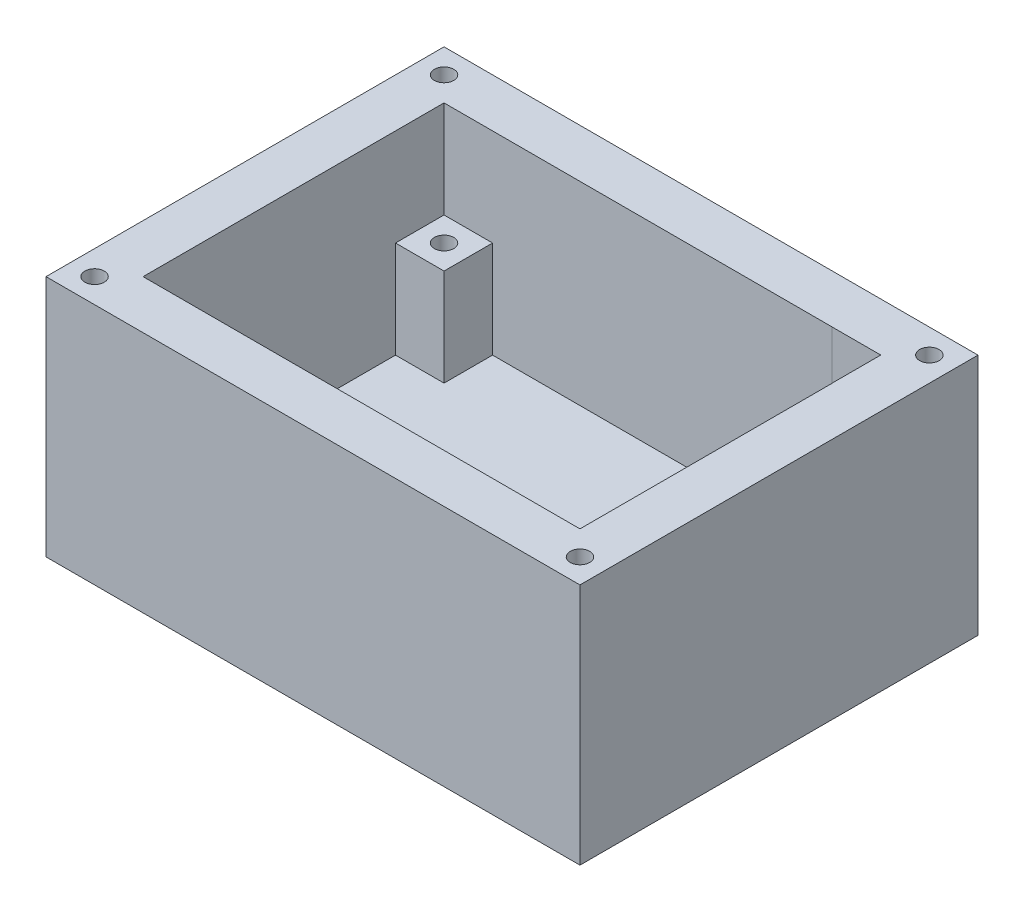
ISO-10303-21;
HEADER;
FILE_DESCRIPTION(('STEP AP214'),'2;1');
FILE_NAME('part.step','',(''),(''),'','','');
FILE_SCHEMA(('AUTOMOTIVE_DESIGN { 1 0 10303 214 1 1 1 1 }'));
ENDSEC;
DATA;
#1=APPLICATION_CONTEXT('core data for automotive mechanical design processes');
#2=APPLICATION_PROTOCOL_DEFINITION('international standard','automotive_design',2000,#1);
#3=PRODUCT_CONTEXT('',#1,'mechanical');
#4=PRODUCT('Part','Part','',(#3));
#5=PRODUCT_RELATED_PRODUCT_CATEGORY('part','',(#4));
#6=PRODUCT_DEFINITION_FORMATION('','',#4);
#7=PRODUCT_DEFINITION_CONTEXT('part definition',#1,'design');
#8=PRODUCT_DEFINITION('design','',#6,#7);
#9=PRODUCT_DEFINITION_SHAPE('','',#8);
#10=(LENGTH_UNIT() NAMED_UNIT(*) SI_UNIT(.MILLI.,.METRE.));
#11=(NAMED_UNIT(*) PLANE_ANGLE_UNIT() SI_UNIT($,.RADIAN.));
#12=(NAMED_UNIT(*) SI_UNIT($,.STERADIAN.) SOLID_ANGLE_UNIT());
#13=UNCERTAINTY_MEASURE_WITH_UNIT(LENGTH_MEASURE(1.E-05),#10,'distance_accuracy_value','');
#14=(GEOMETRIC_REPRESENTATION_CONTEXT(3) GLOBAL_UNCERTAINTY_ASSIGNED_CONTEXT((#13)) GLOBAL_UNIT_ASSIGNED_CONTEXT((#10,
#11,#12)) REPRESENTATION_CONTEXT('',''));
#15=CARTESIAN_POINT('',(0.,0.,0.));
#16=DIRECTION('',(0.,0.,1.));
#17=DIRECTION('',(1.,0.,0.));
#18=AXIS2_PLACEMENT_3D('',#15,#16,#17);
#19=CARTESIAN_POINT('',(0.,20.,-9.99999999999999));
#20=DIRECTION('',(0.,0.,1.));
#21=DIRECTION('',(1.,0.,0.));
#22=AXIS2_PLACEMENT_3D('',#19,#20,#21);
#23=PLANE('',#22);
#24=DIRECTION('',(-1.,0.,0.));
#25=VECTOR('',#24,1.);
#26=CARTESIAN_POINT('',(-10.,10.,-9.99999999999999));
#27=LINE('',#26,#25);
#28=CARTESIAN_POINT('',(-5.,10.,-9.99999999999999));
#29=VERTEX_POINT('',#28);
#30=CARTESIAN_POINT('',(-10.,10.,-9.99999999999999));
#31=VERTEX_POINT('',#30);
#32=EDGE_CURVE('E427',#29,#31,#27,.T.);
#33=ORIENTED_EDGE('',*,*,#32,.F.);
#34=DIRECTION('',(0.,-1.,0.));
#35=VECTOR('',#34,1.);
#36=CARTESIAN_POINT('',(-5.,20.,-9.99999999999999));
#37=LINE('',#36,#35);
#38=CARTESIAN_POINT('',(-5.,0.,-9.99999999999999));
#39=VERTEX_POINT('',#38);
#40=EDGE_CURVE('E190',#29,#39,#37,.T.);
#41=ORIENTED_EDGE('',*,*,#40,.T.);
#42=DIRECTION('',(-1.,0.,0.));
#43=VECTOR('',#42,1.);
#44=CARTESIAN_POINT('',(0.,0.,-9.99999999999999));
#45=LINE('',#44,#43);
#46=CARTESIAN_POINT('',(-10.,0.,-9.99999999999999));
#47=VERTEX_POINT('',#46);
#48=EDGE_CURVE('E144',#39,#47,#45,.T.);
#49=ORIENTED_EDGE('',*,*,#48,.T.);
#50=DIRECTION('',(0.,-1.,0.));
#51=VECTOR('',#50,1.);
#52=CARTESIAN_POINT('',(-10.,20.,-9.99999999999999));
#53=LINE('',#52,#51);
#54=EDGE_CURVE('E187',#31,#47,#53,.T.);
#55=ORIENTED_EDGE('',*,*,#54,.F.);
#56=EDGE_LOOP('',(#33,#41,#49,#55));
#57=FACE_BOUND('',#56,.T.);
#58=ADVANCED_FACE('F34',(#57),#23,.F.);
#59=CARTESIAN_POINT('',(-10.,20.,0.));
#60=DIRECTION('',(-1.,0.,0.));
#61=DIRECTION('',(0.,0.,1.));
#62=AXIS2_PLACEMENT_3D('',#59,#60,#61);
#63=PLANE('',#62);
#64=DIRECTION('',(0.,-1.,0.));
#65=VECTOR('',#64,1.);
#66=CARTESIAN_POINT('',(-10.,20.,-5.));
#67=LINE('',#66,#65);
#68=CARTESIAN_POINT('',(-10.,10.,-5.));
#69=VERTEX_POINT('',#68);
#70=CARTESIAN_POINT('',(-10.,0.,-5.));
#71=VERTEX_POINT('',#70);
#72=EDGE_CURVE('E184',#69,#71,#67,.T.);
#73=ORIENTED_EDGE('',*,*,#72,.F.);
#74=DIRECTION('',(0.,0.,1.));
#75=VECTOR('',#74,1.);
#76=CARTESIAN_POINT('',(-10.,10.,-9.99999999999999));
#77=LINE('',#76,#75);
#78=EDGE_CURVE('E439',#31,#69,#77,.T.);
#79=ORIENTED_EDGE('',*,*,#78,.F.);
#80=ORIENTED_EDGE('',*,*,#54,.T.);
#81=DIRECTION('',(0.,0.,-1.));
#82=VECTOR('',#81,1.);
#83=CARTESIAN_POINT('',(-10.,0.,0.));
#84=LINE('',#83,#82);
#85=EDGE_CURVE('E147',#71,#47,#84,.T.);
#86=ORIENTED_EDGE('',*,*,#85,.F.);
#87=EDGE_LOOP('',(#73,#79,#80,#86));
#88=FACE_BOUND('',#87,.T.);
#89=ADVANCED_FACE('F344',(#88),#63,.T.);
#90=CARTESIAN_POINT('',(-45.,20.,0.));
#91=DIRECTION('',(1.,0.,0.));
#92=DIRECTION('',(0.,0.,-1.));
#93=AXIS2_PLACEMENT_3D('',#90,#91,#92);
#94=PLANE('',#93);
#95=DIRECTION('',(0.,-1.,0.));
#96=VECTOR('',#95,1.);
#97=CARTESIAN_POINT('',(-45.,20.,-36.));
#98=LINE('',#97,#96);
#99=CARTESIAN_POINT('',(-45.,10.,-36.));
#100=VERTEX_POINT('',#99);
#101=CARTESIAN_POINT('',(-45.,0.,-36.));
#102=VERTEX_POINT('',#101);
#103=EDGE_CURVE('E38',#100,#102,#98,.T.);
#104=ORIENTED_EDGE('',*,*,#103,.F.);
#105=DIRECTION('',(0.,0.,-1.));
#106=VECTOR('',#105,1.);
#107=CARTESIAN_POINT('',(-45.,10.,-31.));
#108=LINE('',#107,#106);
#109=CARTESIAN_POINT('',(-45.,10.,-31.));
#110=VERTEX_POINT('',#109);
#111=EDGE_CURVE('E438',#110,#100,#108,.T.);
#112=ORIENTED_EDGE('',*,*,#111,.F.);
#113=DIRECTION('',(0.,-1.,0.));
#114=VECTOR('',#113,1.);
#115=CARTESIAN_POINT('',(-45.,20.,-31.));
#116=LINE('',#115,#114);
#117=CARTESIAN_POINT('',(-45.,0.,-31.));
#118=VERTEX_POINT('',#117);
#119=EDGE_CURVE('E129',#110,#118,#116,.T.);
#120=ORIENTED_EDGE('',*,*,#119,.T.);
#121=DIRECTION('',(0.,0.,1.));
#122=VECTOR('',#121,1.);
#123=CARTESIAN_POINT('',(-45.,0.,0.));
#124=LINE('',#123,#122);
#125=EDGE_CURVE('E133',#102,#118,#124,.T.);
#126=ORIENTED_EDGE('',*,*,#125,.F.);
#127=EDGE_LOOP('',(#104,#112,#120,#126));
#128=FACE_BOUND('',#127,.T.);
#129=ADVANCED_FACE('F36',(#128),#94,.T.);
#130=CARTESIAN_POINT('',(0.,20.,-31.));
#131=DIRECTION('',(0.,0.,-1.));
#132=DIRECTION('',(-1.,0.,0.));
#133=AXIS2_PLACEMENT_3D('',#130,#131,#132);
#134=PLANE('',#133);
#135=DIRECTION('',(1.,0.,0.));
#136=VECTOR('',#135,1.);
#137=CARTESIAN_POINT('',(-45.,10.,-31.));
#138=LINE('',#137,#136);
#139=CARTESIAN_POINT('',(-50.,10.,-31.));
#140=VERTEX_POINT('',#139);
#141=EDGE_CURVE('E321',#140,#110,#138,.T.);
#142=ORIENTED_EDGE('',*,*,#141,.F.);
#143=DIRECTION('',(0.,-1.,0.));
#144=VECTOR('',#143,1.);
#145=CARTESIAN_POINT('',(-50.,20.,-31.));
#146=LINE('',#145,#144);
#147=CARTESIAN_POINT('',(-50.,0.,-31.));
#148=VERTEX_POINT('',#147);
#149=EDGE_CURVE('E172',#140,#148,#146,.T.);
#150=ORIENTED_EDGE('',*,*,#149,.T.);
#151=DIRECTION('',(1.,0.,0.));
#152=VECTOR('',#151,1.);
#153=CARTESIAN_POINT('',(0.,0.,-31.));
#154=LINE('',#153,#152);
#155=EDGE_CURVE('E162',#148,#118,#154,.T.);
#156=ORIENTED_EDGE('',*,*,#155,.T.);
#157=ORIENTED_EDGE('',*,*,#119,.F.);
#158=EDGE_LOOP('',(#142,#150,#156,#157));
#159=FACE_BOUND('',#158,.T.);
#160=ADVANCED_FACE('F377',(#159),#134,.F.);
#161=CARTESIAN_POINT('',(0.,20.,-41.));
#162=DIRECTION('',(0.,0.,1.));
#163=DIRECTION('',(1.,0.,0.));
#164=AXIS2_PLACEMENT_3D('',#161,#162,#163);
#165=PLANE('',#164);
#166=DIRECTION('',(0.,-1.,0.));
#167=VECTOR('',#166,1.);
#168=CARTESIAN_POINT('',(0.,20.,-41.));
#169=LINE('',#168,#167);
#170=CARTESIAN_POINT('',(0.,20.,-41.));
#171=VERTEX_POINT('',#170);
#172=CARTESIAN_POINT('',(0.,-5.,-41.));
#173=VERTEX_POINT('',#172);
#174=EDGE_CURVE('E166',#171,#173,#169,.T.);
#175=ORIENTED_EDGE('',*,*,#174,.T.);
#176=DIRECTION('',(1.,0.,0.));
#177=VECTOR('',#176,1.);
#178=CARTESIAN_POINT('',(-55.,-5.,-41.));
#179=LINE('',#178,#177);
#180=CARTESIAN_POINT('',(-55.,-5.,-41.));
#181=VERTEX_POINT('',#180);
#182=EDGE_CURVE('E555',#181,#173,#179,.T.);
#183=ORIENTED_EDGE('',*,*,#182,.F.);
#184=DIRECTION('',(0.,-1.,0.));
#185=VECTOR('',#184,1.);
#186=CARTESIAN_POINT('',(-55.,20.,-41.));
#187=LINE('',#186,#185);
#188=CARTESIAN_POINT('',(-55.,20.,-41.));
#189=VERTEX_POINT('',#188);
#190=EDGE_CURVE('E11',#189,#181,#187,.T.);
#191=ORIENTED_EDGE('',*,*,#190,.F.);
#192=DIRECTION('',(-1.,0.,0.));
#193=VECTOR('',#192,1.);
#194=CARTESIAN_POINT('',(0.,20.,-41.));
#195=LINE('',#194,#193);
#196=EDGE_CURVE('E123',#171,#189,#195,.T.);
#197=ORIENTED_EDGE('',*,*,#196,.F.);
#198=EDGE_LOOP('',(#175,#183,#191,#197));
#199=FACE_BOUND('',#198,.T.);
#200=ADVANCED_FACE('F371',(#199),#165,.F.);
#201=CARTESIAN_POINT('',(-55.,20.,0.));
#202=DIRECTION('',(-1.,0.,0.));
#203=DIRECTION('',(0.,0.,1.));
#204=AXIS2_PLACEMENT_3D('',#201,#202,#203);
#205=PLANE('',#204);
#206=ORIENTED_EDGE('',*,*,#190,.T.);
#207=DIRECTION('',(0.,0.,-1.));
#208=VECTOR('',#207,1.);
#209=CARTESIAN_POINT('',(-55.,-5.,0.));
#210=LINE('',#209,#208);
#211=CARTESIAN_POINT('',(-55.,-5.,0.));
#212=VERTEX_POINT('',#211);
#213=EDGE_CURVE('E113',#212,#181,#210,.T.);
#214=ORIENTED_EDGE('',*,*,#213,.F.);
#215=DIRECTION('',(0.,-1.,0.));
#216=VECTOR('',#215,1.);
#217=CARTESIAN_POINT('',(-55.,20.,0.));
#218=LINE('',#217,#216);
#219=CARTESIAN_POINT('',(-55.,20.,0.));
#220=VERTEX_POINT('',#219);
#221=EDGE_CURVE('E43',#220,#212,#218,.T.);
#222=ORIENTED_EDGE('',*,*,#221,.F.);
#223=DIRECTION('',(0.,0.,-1.));
#224=VECTOR('',#223,1.);
#225=CARTESIAN_POINT('',(-55.,20.,0.));
#226=LINE('',#225,#224);
#227=EDGE_CURVE('E110',#220,#189,#226,.T.);
#228=ORIENTED_EDGE('',*,*,#227,.T.);
#229=EDGE_LOOP('',(#206,#214,#222,#228));
#230=FACE_BOUND('',#229,.T.);
#231=ADVANCED_FACE('F109',(#230),#205,.T.);
#232=CARTESIAN_POINT('',(0.,20.,0.));
#233=DIRECTION('',(0.,0.,1.));
#234=DIRECTION('',(1.,0.,0.));
#235=AXIS2_PLACEMENT_3D('',#232,#233,#234);
#236=PLANE('',#235);
#237=ORIENTED_EDGE('',*,*,#221,.T.);
#238=DIRECTION('',(-1.,0.,0.));
#239=VECTOR('',#238,1.);
#240=CARTESIAN_POINT('',(-55.,-5.,0.));
#241=LINE('',#240,#239);
#242=CARTESIAN_POINT('',(0.,-5.,0.));
#243=VERTEX_POINT('',#242);
#244=EDGE_CURVE('E561',#243,#212,#241,.T.);
#245=ORIENTED_EDGE('',*,*,#244,.F.);
#246=DIRECTION('',(0.,-1.,0.));
#247=VECTOR('',#246,1.);
#248=CARTESIAN_POINT('',(0.,20.,0.));
#249=LINE('',#248,#247);
#250=CARTESIAN_POINT('',(0.,20.,0.));
#251=VERTEX_POINT('',#250);
#252=EDGE_CURVE('E118',#251,#243,#249,.T.);
#253=ORIENTED_EDGE('',*,*,#252,.F.);
#254=DIRECTION('',(-1.,0.,0.));
#255=VECTOR('',#254,1.);
#256=CARTESIAN_POINT('',(0.,20.,0.));
#257=LINE('',#256,#255);
#258=EDGE_CURVE('E121',#251,#220,#257,.T.);
#259=ORIENTED_EDGE('',*,*,#258,.T.);
#260=EDGE_LOOP('',(#237,#245,#253,#259));
#261=FACE_BOUND('',#260,.T.);
#262=ADVANCED_FACE('F126',(#261),#236,.T.);
#263=CARTESIAN_POINT('',(0.,20.,-36.));
#264=DIRECTION('',(0.,0.,-1.));
#265=DIRECTION('',(-1.,0.,0.));
#266=AXIS2_PLACEMENT_3D('',#263,#264,#265);
#267=PLANE('',#266);
#268=DIRECTION('',(1.,0.,0.));
#269=VECTOR('',#268,1.);
#270=CARTESIAN_POINT('',(0.,0.,-36.));
#271=LINE('',#270,#269);
#272=CARTESIAN_POINT('',(-10.0136520481523,0.,-36.));
#273=VERTEX_POINT('',#272);
#274=EDGE_CURVE('E136',#102,#273,#271,.T.);
#275=ORIENTED_EDGE('',*,*,#274,.T.);
#276=DIRECTION('',(0.,-1.,0.));
#277=VECTOR('',#276,1.);
#278=CARTESIAN_POINT('',(-10.0136520481523,20.,-36.));
#279=LINE('',#278,#277);
#280=CARTESIAN_POINT('',(-10.0136520481523,20.,-36.));
#281=VERTEX_POINT('',#280);
#282=EDGE_CURVE('E198',#281,#273,#279,.T.);
#283=ORIENTED_EDGE('',*,*,#282,.F.);
#284=DIRECTION('',(1.,0.,0.));
#285=VECTOR('',#284,1.);
#286=CARTESIAN_POINT('',(0.,20.,-36.));
#287=LINE('',#286,#285);
#288=CARTESIAN_POINT('',(-50.,20.,-36.));
#289=VERTEX_POINT('',#288);
#290=EDGE_CURVE('E165',#289,#281,#287,.T.);
#291=ORIENTED_EDGE('',*,*,#290,.F.);
#292=DIRECTION('',(0.,1.,0.));
#293=VECTOR('',#292,1.);
#294=CARTESIAN_POINT('',(-50.,10.,-36.));
#295=LINE('',#294,#293);
#296=CARTESIAN_POINT('',(-50.,10.,-36.));
#297=VERTEX_POINT('',#296);
#298=EDGE_CURVE('E315',#297,#289,#295,.T.);
#299=ORIENTED_EDGE('',*,*,#298,.F.);
#300=DIRECTION('',(-1.,0.,0.));
#301=VECTOR('',#300,1.);
#302=CARTESIAN_POINT('',(-45.,10.,-36.));
#303=LINE('',#302,#301);
#304=EDGE_CURVE('E213',#100,#297,#303,.T.);
#305=ORIENTED_EDGE('',*,*,#304,.F.);
#306=ORIENTED_EDGE('',*,*,#103,.T.);
#307=EDGE_LOOP('',(#275,#283,#291,#299,#305,#306));
#308=FACE_BOUND('',#307,.T.);
#309=ADVANCED_FACE('F209',(#308),#267,.F.);
#310=CARTESIAN_POINT('',(-10.0136520481523,20.,0.));
#311=DIRECTION('',(1.,0.,0.));
#312=DIRECTION('',(0.,0.,-1.));
#313=AXIS2_PLACEMENT_3D('',#310,#311,#312);
#314=PLANE('',#313);
#315=DIRECTION('',(0.,0.,1.));
#316=VECTOR('',#315,1.);
#317=CARTESIAN_POINT('',(-10.0136520481523,10.,-30.9979103253553));
#318=LINE('',#317,#316);
#319=CARTESIAN_POINT('',(-10.0136520481523,10.,-35.9979103253553));
#320=VERTEX_POINT('',#319);
#321=CARTESIAN_POINT('',(-10.0136520481523,10.,-30.9979103253553));
#322=VERTEX_POINT('',#321);
#323=EDGE_CURVE('E284',#320,#322,#318,.T.);
#324=ORIENTED_EDGE('',*,*,#323,.F.);
#325=DIRECTION('',(0.,1.,0.));
#326=VECTOR('',#325,1.);
#327=CARTESIAN_POINT('',(-10.0136520481523,10.,-35.9979103253553));
#328=LINE('',#327,#326);
#329=CARTESIAN_POINT('',(-10.0136520481523,20.,-35.9979103253553));
#330=VERTEX_POINT('',#329);
#331=EDGE_CURVE('E86',#320,#330,#328,.T.);
#332=ORIENTED_EDGE('',*,*,#331,.T.);
#333=DIRECTION('',(0.,0.,1.));
#334=VECTOR('',#333,1.);
#335=CARTESIAN_POINT('',(-10.0136520481523,20.,0.));
#336=LINE('',#335,#334);
#337=EDGE_CURVE('E298',#281,#330,#336,.T.);
#338=ORIENTED_EDGE('',*,*,#337,.F.);
#339=ORIENTED_EDGE('',*,*,#282,.T.);
#340=DIRECTION('',(0.,0.,1.));
#341=VECTOR('',#340,1.);
#342=CARTESIAN_POINT('',(-10.0136520481523,0.,0.));
#343=LINE('',#342,#341);
#344=CARTESIAN_POINT('',(-10.0136520481523,0.,-30.9979103253553));
#345=VERTEX_POINT('',#344);
#346=EDGE_CURVE('E74',#273,#345,#343,.T.);
#347=ORIENTED_EDGE('',*,*,#346,.T.);
#348=DIRECTION('',(0.,-1.,0.));
#349=VECTOR('',#348,1.);
#350=CARTESIAN_POINT('',(-10.0136520481523,20.,-30.9979103253553));
#351=LINE('',#350,#349);
#352=EDGE_CURVE('E196',#322,#345,#351,.T.);
#353=ORIENTED_EDGE('',*,*,#352,.F.);
#354=EDGE_LOOP('',(#324,#332,#338,#339,#347,#353));
#355=FACE_BOUND('',#354,.T.);
#356=ADVANCED_FACE('F329',(#355),#314,.F.);
#357=CARTESIAN_POINT('',(0.,20.,-30.9979103253553));
#358=DIRECTION('',(0.,0.,1.));
#359=DIRECTION('',(1.,0.,0.));
#360=AXIS2_PLACEMENT_3D('',#357,#358,#359);
#361=PLANE('',#360);
#362=DIRECTION('',(0.,1.,0.));
#363=VECTOR('',#362,1.);
#364=CARTESIAN_POINT('',(-5.01365204815232,10.,-30.9979103253553));
#365=LINE('',#364,#363);
#366=CARTESIAN_POINT('',(-5.01365204815232,10.,-30.9979103253553));
#367=VERTEX_POINT('',#366);
#368=CARTESIAN_POINT('',(-5.01365204815232,20.,-30.9979103253553));
#369=VERTEX_POINT('',#368);
#370=EDGE_CURVE('E51',#367,#369,#365,.T.);
#371=ORIENTED_EDGE('',*,*,#370,.F.);
#372=DIRECTION('',(1.,0.,0.));
#373=VECTOR('',#372,1.);
#374=CARTESIAN_POINT('',(-10.0136520481523,10.,-30.9979103253553));
#375=LINE('',#374,#373);
#376=EDGE_CURVE('E279',#322,#367,#375,.T.);
#377=ORIENTED_EDGE('',*,*,#376,.F.);
#378=ORIENTED_EDGE('',*,*,#352,.T.);
#379=DIRECTION('',(-1.,0.,0.));
#380=VECTOR('',#379,1.);
#381=CARTESIAN_POINT('',(0.,0.,-30.9979103253553));
#382=LINE('',#381,#380);
#383=CARTESIAN_POINT('',(-5.,0.,-30.9979103253553));
#384=VERTEX_POINT('',#383);
#385=EDGE_CURVE('E139',#384,#345,#382,.T.);
#386=ORIENTED_EDGE('',*,*,#385,.F.);
#387=DIRECTION('',(0.,-1.,0.));
#388=VECTOR('',#387,1.);
#389=CARTESIAN_POINT('',(-5.,20.,-30.9979103253553));
#390=LINE('',#389,#388);
#391=CARTESIAN_POINT('',(-5.,20.,-30.9979103253553));
#392=VERTEX_POINT('',#391);
#393=EDGE_CURVE('E193',#392,#384,#390,.T.);
#394=ORIENTED_EDGE('',*,*,#393,.F.);
#395=DIRECTION('',(-1.,0.,0.));
#396=VECTOR('',#395,1.);
#397=CARTESIAN_POINT('',(0.,20.,-30.9979103253553));
#398=LINE('',#397,#396);
#399=EDGE_CURVE('E291',#392,#369,#398,.T.);
#400=ORIENTED_EDGE('',*,*,#399,.T.);
#401=EDGE_LOOP('',(#371,#377,#378,#386,#394,#400));
#402=FACE_BOUND('',#401,.T.);
#403=ADVANCED_FACE('F289',(#402),#361,.T.);
#404=CARTESIAN_POINT('',(-5.,20.,0.));
#405=DIRECTION('',(-1.,0.,0.));
#406=DIRECTION('',(0.,0.,1.));
#407=AXIS2_PLACEMENT_3D('',#404,#405,#406);
#408=PLANE('',#407);
#409=DIRECTION('',(0.,0.,-1.));
#410=VECTOR('',#409,1.);
#411=CARTESIAN_POINT('',(-5.,0.,0.));
#412=LINE('',#411,#410);
#413=EDGE_CURVE('E141',#39,#384,#412,.T.);
#414=ORIENTED_EDGE('',*,*,#413,.F.);
#415=ORIENTED_EDGE('',*,*,#40,.F.);
#416=DIRECTION('',(0.,0.,-1.));
#417=VECTOR('',#416,1.);
#418=CARTESIAN_POINT('',(-5.,10.,-9.99999999999999));
#419=LINE('',#418,#417);
#420=CARTESIAN_POINT('',(-5.,10.,-5.));
#421=VERTEX_POINT('',#420);
#422=EDGE_CURVE('E446',#421,#29,#419,.T.);
#423=ORIENTED_EDGE('',*,*,#422,.F.);
#424=DIRECTION('',(0.,1.,0.));
#425=VECTOR('',#424,1.);
#426=CARTESIAN_POINT('',(-5.,10.,-5.));
#427=LINE('',#426,#425);
#428=CARTESIAN_POINT('',(-5.,20.,-5.));
#429=VERTEX_POINT('',#428);
#430=EDGE_CURVE('E423',#421,#429,#427,.T.);
#431=ORIENTED_EDGE('',*,*,#430,.T.);
#432=DIRECTION('',(0.,0.,-1.));
#433=VECTOR('',#432,1.);
#434=CARTESIAN_POINT('',(-5.,20.,0.));
#435=LINE('',#434,#433);
#436=EDGE_CURVE('E302',#429,#392,#435,.T.);
#437=ORIENTED_EDGE('',*,*,#436,.T.);
#438=ORIENTED_EDGE('',*,*,#393,.T.);
#439=EDGE_LOOP('',(#414,#415,#423,#431,#437,#438));
#440=FACE_BOUND('',#439,.T.);
#441=ADVANCED_FACE('F355',(#440),#408,.T.);
#442=CARTESIAN_POINT('',(0.,20.,-5.));
#443=DIRECTION('',(0.,0.,1.));
#444=DIRECTION('',(1.,0.,0.));
#445=AXIS2_PLACEMENT_3D('',#442,#443,#444);
#446=PLANE('',#445);
#447=DIRECTION('',(-1.,0.,0.));
#448=VECTOR('',#447,1.);
#449=CARTESIAN_POINT('',(0.,0.,-5.));
#450=LINE('',#449,#448);
#451=CARTESIAN_POINT('',(-45.,0.,-4.99999999999999));
#452=VERTEX_POINT('',#451);
#453=EDGE_CURVE('E150',#71,#452,#450,.T.);
#454=ORIENTED_EDGE('',*,*,#453,.T.);
#455=DIRECTION('',(0.,-1.,0.));
#456=VECTOR('',#455,1.);
#457=CARTESIAN_POINT('',(-45.,20.,-4.99999999999999));
#458=LINE('',#457,#456);
#459=CARTESIAN_POINT('',(-45.,10.,-5.));
#460=VERTEX_POINT('',#459);
#461=EDGE_CURVE('E181',#460,#452,#458,.T.);
#462=ORIENTED_EDGE('',*,*,#461,.F.);
#463=DIRECTION('',(1.,0.,0.));
#464=VECTOR('',#463,1.);
#465=CARTESIAN_POINT('',(-45.,10.,-5.));
#466=LINE('',#465,#464);
#467=CARTESIAN_POINT('',(-50.,10.,-4.99999999999999));
#468=VERTEX_POINT('',#467);
#469=EDGE_CURVE('E434',#468,#460,#466,.T.);
#470=ORIENTED_EDGE('',*,*,#469,.F.);
#471=DIRECTION('',(0.,1.,0.));
#472=VECTOR('',#471,1.);
#473=CARTESIAN_POINT('',(-50.,10.,-4.99999999999999));
#474=LINE('',#473,#472);
#475=CARTESIAN_POINT('',(-50.,20.,-4.99999999999999));
#476=VERTEX_POINT('',#475);
#477=EDGE_CURVE('E436',#468,#476,#474,.T.);
#478=ORIENTED_EDGE('',*,*,#477,.T.);
#479=DIRECTION('',(-1.,0.,0.));
#480=VECTOR('',#479,1.);
#481=CARTESIAN_POINT('',(0.,20.,-5.));
#482=LINE('',#481,#480);
#483=EDGE_CURVE('E305',#429,#476,#482,.T.);
#484=ORIENTED_EDGE('',*,*,#483,.F.);
#485=ORIENTED_EDGE('',*,*,#430,.F.);
#486=DIRECTION('',(1.,0.,0.));
#487=VECTOR('',#486,1.);
#488=CARTESIAN_POINT('',(-10.,10.,-5.));
#489=LINE('',#488,#487);
#490=EDGE_CURVE('E442',#69,#421,#489,.T.);
#491=ORIENTED_EDGE('',*,*,#490,.F.);
#492=ORIENTED_EDGE('',*,*,#72,.T.);
#493=EDGE_LOOP('',(#454,#462,#470,#478,#484,#485,#491,#492));
#494=FACE_BOUND('',#493,.T.);
#495=ADVANCED_FACE('F358',(#494),#446,.F.);
#496=CARTESIAN_POINT('',(-45.,20.,0.));
#497=DIRECTION('',(-1.,0.,0.));
#498=DIRECTION('',(0.,0.,1.));
#499=AXIS2_PLACEMENT_3D('',#496,#497,#498);
#500=PLANE('',#499);
#501=DIRECTION('',(0.,-1.,0.));
#502=VECTOR('',#501,1.);
#503=CARTESIAN_POINT('',(-45.,20.,-9.99999999999999));
#504=LINE('',#503,#502);
#505=CARTESIAN_POINT('',(-45.,10.,-9.99999999999999));
#506=VERTEX_POINT('',#505);
#507=CARTESIAN_POINT('',(-45.,0.,-9.99999999999999));
#508=VERTEX_POINT('',#507);
#509=EDGE_CURVE('E178',#506,#508,#504,.T.);
#510=ORIENTED_EDGE('',*,*,#509,.F.);
#511=DIRECTION('',(0.,0.,-1.));
#512=VECTOR('',#511,1.);
#513=CARTESIAN_POINT('',(-45.,10.,-9.99999999999999));
#514=LINE('',#513,#512);
#515=EDGE_CURVE('E421',#460,#506,#514,.T.);
#516=ORIENTED_EDGE('',*,*,#515,.F.);
#517=ORIENTED_EDGE('',*,*,#461,.T.);
#518=DIRECTION('',(0.,0.,-1.));
#519=VECTOR('',#518,1.);
#520=CARTESIAN_POINT('',(-45.,0.,0.));
#521=LINE('',#520,#519);
#522=EDGE_CURVE('E153',#452,#508,#521,.T.);
#523=ORIENTED_EDGE('',*,*,#522,.T.);
#524=EDGE_LOOP('',(#510,#516,#517,#523));
#525=FACE_BOUND('',#524,.T.);
#526=ADVANCED_FACE('F387',(#525),#500,.F.);
#527=CARTESIAN_POINT('',(0.,20.,-9.99999999999999));
#528=DIRECTION('',(0.,0.,-1.));
#529=DIRECTION('',(-1.,0.,0.));
#530=AXIS2_PLACEMENT_3D('',#527,#528,#529);
#531=PLANE('',#530);
#532=DIRECTION('',(-1.,0.,0.));
#533=VECTOR('',#532,1.);
#534=CARTESIAN_POINT('',(-45.,10.,-9.99999999999999));
#535=LINE('',#534,#533);
#536=CARTESIAN_POINT('',(-50.,10.,-9.99999999999999));
#537=VERTEX_POINT('',#536);
#538=EDGE_CURVE('E419',#506,#537,#535,.T.);
#539=ORIENTED_EDGE('',*,*,#538,.F.);
#540=ORIENTED_EDGE('',*,*,#509,.T.);
#541=DIRECTION('',(1.,0.,0.));
#542=VECTOR('',#541,1.);
#543=CARTESIAN_POINT('',(0.,0.,-9.99999999999999));
#544=LINE('',#543,#542);
#545=CARTESIAN_POINT('',(-50.,0.,-9.99999999999999));
#546=VERTEX_POINT('',#545);
#547=EDGE_CURVE('E156',#546,#508,#544,.T.);
#548=ORIENTED_EDGE('',*,*,#547,.F.);
#549=DIRECTION('',(0.,-1.,0.));
#550=VECTOR('',#549,1.);
#551=CARTESIAN_POINT('',(-50.,20.,-9.99999999999999));
#552=LINE('',#551,#550);
#553=EDGE_CURVE('E175',#537,#546,#552,.T.);
#554=ORIENTED_EDGE('',*,*,#553,.F.);
#555=EDGE_LOOP('',(#539,#540,#548,#554));
#556=FACE_BOUND('',#555,.T.);
#557=ADVANCED_FACE('F384',(#556),#531,.T.);
#558=CARTESIAN_POINT('',(-50.,20.,0.));
#559=DIRECTION('',(-1.,0.,0.));
#560=DIRECTION('',(0.,0.,1.));
#561=AXIS2_PLACEMENT_3D('',#558,#559,#560);
#562=PLANE('',#561);
#563=DIRECTION('',(0.,0.,-1.));
#564=VECTOR('',#563,1.);
#565=CARTESIAN_POINT('',(-50.,0.,0.));
#566=LINE('',#565,#564);
#567=EDGE_CURVE('E159',#546,#148,#566,.T.);
#568=ORIENTED_EDGE('',*,*,#567,.T.);
#569=ORIENTED_EDGE('',*,*,#149,.F.);
#570=DIRECTION('',(0.,0.,1.));
#571=VECTOR('',#570,1.);
#572=CARTESIAN_POINT('',(-50.,10.,-31.));
#573=LINE('',#572,#571);
#574=EDGE_CURVE('E319',#297,#140,#573,.T.);
#575=ORIENTED_EDGE('',*,*,#574,.F.);
#576=ORIENTED_EDGE('',*,*,#298,.T.);
#577=DIRECTION('',(0.,0.,-1.));
#578=VECTOR('',#577,1.);
#579=CARTESIAN_POINT('',(-50.,20.,0.));
#580=LINE('',#579,#578);
#581=EDGE_CURVE('E307',#476,#289,#580,.T.);
#582=ORIENTED_EDGE('',*,*,#581,.F.);
#583=ORIENTED_EDGE('',*,*,#477,.F.);
#584=DIRECTION('',(0.,0.,1.));
#585=VECTOR('',#584,1.);
#586=CARTESIAN_POINT('',(-50.,10.,-9.99999999999999));
#587=LINE('',#586,#585);
#588=EDGE_CURVE('E415',#537,#468,#587,.T.);
#589=ORIENTED_EDGE('',*,*,#588,.F.);
#590=ORIENTED_EDGE('',*,*,#553,.T.);
#591=EDGE_LOOP('',(#568,#569,#575,#576,#582,#583,#589,#590));
#592=FACE_BOUND('',#591,.T.);
#593=ADVANCED_FACE('F317',(#592),#562,.F.);
#594=CARTESIAN_POINT('',(0.,20.,0.));
#595=DIRECTION('',(-1.,0.,0.));
#596=DIRECTION('',(0.,0.,1.));
#597=AXIS2_PLACEMENT_3D('',#594,#595,#596);
#598=PLANE('',#597);
#599=ORIENTED_EDGE('',*,*,#252,.T.);
#600=DIRECTION('',(0.,0.,1.));
#601=VECTOR('',#600,1.);
#602=CARTESIAN_POINT('',(0.,-5.,0.));
#603=LINE('',#602,#601);
#604=EDGE_CURVE('E558',#173,#243,#603,.T.);
#605=ORIENTED_EDGE('',*,*,#604,.F.);
#606=ORIENTED_EDGE('',*,*,#174,.F.);
#607=DIRECTION('',(0.,0.,-1.));
#608=VECTOR('',#607,1.);
#609=CARTESIAN_POINT('',(0.,20.,0.));
#610=LINE('',#609,#608);
#611=EDGE_CURVE('E60',#251,#171,#610,.T.);
#612=ORIENTED_EDGE('',*,*,#611,.F.);
#613=EDGE_LOOP('',(#599,#605,#606,#612));
#614=FACE_BOUND('',#613,.T.);
#615=ADVANCED_FACE('F339',(#614),#598,.F.);
#616=CARTESIAN_POINT('',(0.,20.,0.));
#617=DIRECTION('',(0.,1.,0.));
#618=DIRECTION('',(0.,0.,1.));
#619=AXIS2_PLACEMENT_3D('',#616,#617,#618);
#620=PLANE('',#619);
#621=CARTESIAN_POINT('',(-2.5,20.,-2.5));
#622=DIRECTION('',(0.,1.,0.));
#623=DIRECTION('',(0.,0.,1.));
#624=AXIS2_PLACEMENT_3D('',#621,#622,#623);
#625=CIRCLE('',#624,1.);
#626=CARTESIAN_POINT('',(-2.5,20.,-1.5));
#627=VERTEX_POINT('',#626);
#628=EDGE_CURVE('E532',#627,#627,#625,.T.);
#629=ORIENTED_EDGE('',*,*,#628,.F.);
#630=EDGE_LOOP('',(#629));
#631=FACE_BOUND('',#630,.T.);
#632=CARTESIAN_POINT('',(-52.5,20.,-2.49999999999999));
#633=DIRECTION('',(0.,1.,0.));
#634=DIRECTION('',(0.,0.,1.));
#635=AXIS2_PLACEMENT_3D('',#632,#633,#634);
#636=CIRCLE('',#635,0.999999999999998);
#637=CARTESIAN_POINT('',(-52.5,20.,-1.5));
#638=VERTEX_POINT('',#637);
#639=EDGE_CURVE('E531',#638,#638,#636,.T.);
#640=ORIENTED_EDGE('',*,*,#639,.F.);
#641=EDGE_LOOP('',(#640));
#642=FACE_BOUND('',#641,.T.);
#643=CARTESIAN_POINT('',(-2.50682602407616,20.,-38.4989551626776));
#644=DIRECTION('',(0.,1.,0.));
#645=DIRECTION('',(0.,0.,1.));
#646=AXIS2_PLACEMENT_3D('',#643,#644,#645);
#647=CIRCLE('',#646,1.);
#648=CARTESIAN_POINT('',(-2.50682602407616,20.,-37.4989551626776));
#649=VERTEX_POINT('',#648);
#650=EDGE_CURVE('E541',#649,#649,#647,.T.);
#651=ORIENTED_EDGE('',*,*,#650,.F.);
#652=EDGE_LOOP('',(#651));
#653=FACE_BOUND('',#652,.T.);
#654=CARTESIAN_POINT('',(-52.5,20.,-38.5));
#655=DIRECTION('',(0.,1.,0.));
#656=DIRECTION('',(0.,0.,1.));
#657=AXIS2_PLACEMENT_3D('',#654,#655,#656);
#658=CIRCLE('',#657,0.999999999999998);
#659=CARTESIAN_POINT('',(-52.5,20.,-37.5));
#660=VERTEX_POINT('',#659);
#661=EDGE_CURVE('E546',#660,#660,#658,.T.);
#662=ORIENTED_EDGE('',*,*,#661,.F.);
#663=EDGE_LOOP('',(#662));
#664=FACE_BOUND('',#663,.T.);
#665=ORIENTED_EDGE('',*,*,#483,.T.);
#666=ORIENTED_EDGE('',*,*,#581,.T.);
#667=ORIENTED_EDGE('',*,*,#290,.T.);
#668=ORIENTED_EDGE('',*,*,#337,.T.);
#669=DIRECTION('',(-1.,0.,0.));
#670=VECTOR('',#669,1.);
#671=CARTESIAN_POINT('',(-10.0136520481523,20.,-35.9979103253553));
#672=LINE('',#671,#670);
#673=CARTESIAN_POINT('',(-5.01365204815232,20.,-35.9979103253553));
#674=VERTEX_POINT('',#673);
#675=EDGE_CURVE('E323',#674,#330,#672,.T.);
#676=ORIENTED_EDGE('',*,*,#675,.F.);
#677=DIRECTION('',(0.,0.,-1.));
#678=VECTOR('',#677,1.);
#679=CARTESIAN_POINT('',(-5.01365204815232,20.,-30.9979103253553));
#680=LINE('',#679,#678);
#681=EDGE_CURVE('E320',#369,#674,#680,.T.);
#682=ORIENTED_EDGE('',*,*,#681,.F.);
#683=ORIENTED_EDGE('',*,*,#399,.F.);
#684=ORIENTED_EDGE('',*,*,#436,.F.);
#685=EDGE_LOOP('',(#665,#666,#667,#668,#676,#682,#683,#684));
#686=FACE_BOUND('',#685,.T.);
#687=ORIENTED_EDGE('',*,*,#196,.T.);
#688=ORIENTED_EDGE('',*,*,#227,.F.);
#689=ORIENTED_EDGE('',*,*,#258,.F.);
#690=ORIENTED_EDGE('',*,*,#611,.T.);
#691=EDGE_LOOP('',(#687,#688,#689,#690));
#692=FACE_BOUND('',#691,.T.);
#693=ADVANCED_FACE('F120',(#631,#642,#653,#664,#686,#692),#620,.T.);
#694=CARTESIAN_POINT('',(-10.0136520481523,10.,-35.9979103253553));
#695=DIRECTION('',(0.,0.,-1.));
#696=DIRECTION('',(-1.,0.,0.));
#697=AXIS2_PLACEMENT_3D('',#694,#695,#696);
#698=PLANE('',#697);
#699=ORIENTED_EDGE('',*,*,#675,.T.);
#700=ORIENTED_EDGE('',*,*,#331,.F.);
#701=DIRECTION('',(-1.,0.,0.));
#702=VECTOR('',#701,1.);
#703=CARTESIAN_POINT('',(-10.0136520481523,10.,-35.9979103253553));
#704=LINE('',#703,#702);
#705=CARTESIAN_POINT('',(-5.01365204815232,10.,-35.9979103253553));
#706=VERTEX_POINT('',#705);
#707=EDGE_CURVE('E278',#706,#320,#704,.T.);
#708=ORIENTED_EDGE('',*,*,#707,.F.);
#709=DIRECTION('',(0.,1.,0.));
#710=VECTOR('',#709,1.);
#711=CARTESIAN_POINT('',(-5.01365204815232,10.,-35.9979103253553));
#712=LINE('',#711,#710);
#713=EDGE_CURVE('E276',#706,#674,#712,.T.);
#714=ORIENTED_EDGE('',*,*,#713,.T.);
#715=EDGE_LOOP('',(#699,#700,#708,#714));
#716=FACE_BOUND('',#715,.T.);
#717=ADVANCED_FACE('F331',(#716),#698,.F.);
#718=CARTESIAN_POINT('',(-5.01365204815232,10.,-30.9979103253553));
#719=DIRECTION('',(1.,0.,0.));
#720=DIRECTION('',(0.,0.,-1.));
#721=AXIS2_PLACEMENT_3D('',#718,#719,#720);
#722=PLANE('',#721);
#723=ORIENTED_EDGE('',*,*,#681,.T.);
#724=ORIENTED_EDGE('',*,*,#713,.F.);
#725=DIRECTION('',(0.,0.,-1.));
#726=VECTOR('',#725,1.);
#727=CARTESIAN_POINT('',(-5.01365204815232,10.,-30.9979103253553));
#728=LINE('',#727,#726);
#729=EDGE_CURVE('E273',#367,#706,#728,.T.);
#730=ORIENTED_EDGE('',*,*,#729,.F.);
#731=ORIENTED_EDGE('',*,*,#370,.T.);
#732=EDGE_LOOP('',(#723,#724,#730,#731));
#733=FACE_BOUND('',#732,.T.);
#734=ADVANCED_FACE('F275',(#733),#722,.F.);
#735=CARTESIAN_POINT('',(0.,10.,0.));
#736=DIRECTION('',(0.,-1.,0.));
#737=DIRECTION('',(0.,0.,-1.));
#738=AXIS2_PLACEMENT_3D('',#735,#736,#737);
#739=PLANE('',#738);
#740=CARTESIAN_POINT('',(-7.51365204815232,10.,-33.4979103253553));
#741=DIRECTION('',(0.,1.,0.));
#742=DIRECTION('',(0.,0.,1.));
#743=AXIS2_PLACEMENT_3D('',#740,#741,#742);
#744=CIRCLE('',#743,1.);
#745=CARTESIAN_POINT('',(-7.51365204815232,10.,-32.4979103253553));
#746=VERTEX_POINT('',#745);
#747=EDGE_CURVE('E573',#746,#746,#744,.T.);
#748=ORIENTED_EDGE('',*,*,#747,.F.);
#749=EDGE_LOOP('',(#748));
#750=FACE_BOUND('',#749,.T.);
#751=ORIENTED_EDGE('',*,*,#323,.T.);
#752=ORIENTED_EDGE('',*,*,#376,.T.);
#753=ORIENTED_EDGE('',*,*,#729,.T.);
#754=ORIENTED_EDGE('',*,*,#707,.T.);
#755=EDGE_LOOP('',(#751,#752,#753,#754));
#756=FACE_BOUND('',#755,.T.);
#757=ADVANCED_FACE('F282',(#750,#756),#739,.F.);
#758=CARTESIAN_POINT('',(0.,10.,0.));
#759=DIRECTION('',(0.,1.,0.));
#760=DIRECTION('',(0.,0.,1.));
#761=AXIS2_PLACEMENT_3D('',#758,#759,#760);
#762=PLANE('',#761);
#763=CARTESIAN_POINT('',(-47.5,10.,-33.5));
#764=DIRECTION('',(0.,1.,0.));
#765=DIRECTION('',(0.,0.,1.));
#766=AXIS2_PLACEMENT_3D('',#763,#764,#765);
#767=CIRCLE('',#766,0.999999999999998);
#768=CARTESIAN_POINT('',(-47.5,10.,-32.5));
#769=VERTEX_POINT('',#768);
#770=EDGE_CURVE('E430',#769,#769,#767,.T.);
#771=ORIENTED_EDGE('',*,*,#770,.F.);
#772=EDGE_LOOP('',(#771));
#773=FACE_BOUND('',#772,.T.);
#774=ORIENTED_EDGE('',*,*,#111,.T.);
#775=ORIENTED_EDGE('',*,*,#304,.T.);
#776=ORIENTED_EDGE('',*,*,#574,.T.);
#777=ORIENTED_EDGE('',*,*,#141,.T.);
#778=EDGE_LOOP('',(#774,#775,#776,#777));
#779=FACE_BOUND('',#778,.T.);
#780=ADVANCED_FACE('F452',(#773,#779),#762,.T.);
#781=CARTESIAN_POINT('',(0.,10.,0.));
#782=DIRECTION('',(0.,1.,0.));
#783=DIRECTION('',(0.,0.,1.));
#784=AXIS2_PLACEMENT_3D('',#781,#782,#783);
#785=PLANE('',#784);
#786=CARTESIAN_POINT('',(-7.5,10.,-7.5));
#787=DIRECTION('',(0.,1.,0.));
#788=DIRECTION('',(0.,0.,1.));
#789=AXIS2_PLACEMENT_3D('',#786,#787,#788);
#790=CIRCLE('',#789,1.);
#791=CARTESIAN_POINT('',(-7.5,10.,-6.5));
#792=VERTEX_POINT('',#791);
#793=EDGE_CURVE('E563',#792,#792,#790,.T.);
#794=ORIENTED_EDGE('',*,*,#793,.F.);
#795=EDGE_LOOP('',(#794));
#796=FACE_BOUND('',#795,.T.);
#797=ORIENTED_EDGE('',*,*,#78,.T.);
#798=ORIENTED_EDGE('',*,*,#490,.T.);
#799=ORIENTED_EDGE('',*,*,#422,.T.);
#800=ORIENTED_EDGE('',*,*,#32,.T.);
#801=EDGE_LOOP('',(#797,#798,#799,#800));
#802=FACE_BOUND('',#801,.T.);
#803=ADVANCED_FACE('F454',(#796,#802),#785,.T.);
#804=CARTESIAN_POINT('',(0.,10.,0.));
#805=DIRECTION('',(0.,-1.,0.));
#806=DIRECTION('',(0.,0.,-1.));
#807=AXIS2_PLACEMENT_3D('',#804,#805,#806);
#808=PLANE('',#807);
#809=CARTESIAN_POINT('',(-47.5,10.,-7.5));
#810=DIRECTION('',(0.,1.,0.));
#811=DIRECTION('',(0.,0.,1.));
#812=AXIS2_PLACEMENT_3D('',#809,#810,#811);
#813=CIRCLE('',#812,0.999999999999998);
#814=CARTESIAN_POINT('',(-47.5,10.,-6.5));
#815=VERTEX_POINT('',#814);
#816=EDGE_CURVE('E567',#815,#815,#813,.T.);
#817=ORIENTED_EDGE('',*,*,#816,.F.);
#818=EDGE_LOOP('',(#817));
#819=FACE_BOUND('',#818,.T.);
#820=ORIENTED_EDGE('',*,*,#515,.T.);
#821=ORIENTED_EDGE('',*,*,#538,.T.);
#822=ORIENTED_EDGE('',*,*,#588,.T.);
#823=ORIENTED_EDGE('',*,*,#469,.T.);
#824=EDGE_LOOP('',(#820,#821,#822,#823));
#825=FACE_BOUND('',#824,.T.);
#826=ADVANCED_FACE('F461',(#819,#825),#808,.F.);
#827=CARTESIAN_POINT('',(-47.5,0.,-33.5));
#828=DIRECTION('',(0.,1.,0.));
#829=DIRECTION('',(0.,0.,1.));
#830=AXIS2_PLACEMENT_3D('',#827,#828,#829);
#831=CYLINDRICAL_SURFACE('',#830,0.999999999999998);
#832=CARTESIAN_POINT('',(-47.5,0.,-33.5));
#833=DIRECTION('',(0.,1.,0.));
#834=DIRECTION('',(0.,0.,1.));
#835=AXIS2_PLACEMENT_3D('',#832,#833,#834);
#836=CIRCLE('',#835,0.999999999999998);
#837=CARTESIAN_POINT('',(-47.5,0.,-32.5));
#838=VERTEX_POINT('',#837);
#839=EDGE_CURVE('E443',#838,#838,#836,.T.);
#840=ORIENTED_EDGE('',*,*,#839,.F.);
#841=EDGE_LOOP('',(#840));
#842=FACE_BOUND('',#841,.T.);
#843=ORIENTED_EDGE('',*,*,#770,.T.);
#844=EDGE_LOOP('',(#843));
#845=FACE_BOUND('',#844,.T.);
#846=ADVANCED_FACE('F469',(#842,#845),#831,.F.);
#847=CARTESIAN_POINT('',(-7.51365204815232,0.,-33.4979103253553));
#848=DIRECTION('',(0.,1.,0.));
#849=DIRECTION('',(0.,0.,1.));
#850=AXIS2_PLACEMENT_3D('',#847,#848,#849);
#851=CYLINDRICAL_SURFACE('',#850,1.);
#852=CARTESIAN_POINT('',(-7.51365204815232,0.,-33.4979103253553));
#853=DIRECTION('',(0.,1.,0.));
#854=DIRECTION('',(0.,0.,1.));
#855=AXIS2_PLACEMENT_3D('',#852,#853,#854);
#856=CIRCLE('',#855,1.);
#857=CARTESIAN_POINT('',(-7.51365204815232,0.,-32.4979103253553));
#858=VERTEX_POINT('',#857);
#859=EDGE_CURVE('E576',#858,#858,#856,.T.);
#860=ORIENTED_EDGE('',*,*,#859,.F.);
#861=EDGE_LOOP('',(#860));
#862=FACE_BOUND('',#861,.T.);
#863=ORIENTED_EDGE('',*,*,#747,.T.);
#864=EDGE_LOOP('',(#863));
#865=FACE_BOUND('',#864,.T.);
#866=ADVANCED_FACE('F473',(#862,#865),#851,.F.);
#867=CARTESIAN_POINT('',(-47.5,0.,-7.5));
#868=DIRECTION('',(0.,1.,0.));
#869=DIRECTION('',(0.,0.,1.));
#870=AXIS2_PLACEMENT_3D('',#867,#868,#869);
#871=CYLINDRICAL_SURFACE('',#870,0.999999999999998);
#872=CARTESIAN_POINT('',(-47.5,0.,-7.5));
#873=DIRECTION('',(0.,1.,0.));
#874=DIRECTION('',(0.,0.,1.));
#875=AXIS2_PLACEMENT_3D('',#872,#873,#874);
#876=CIRCLE('',#875,0.999999999999998);
#877=CARTESIAN_POINT('',(-47.5,0.,-6.5));
#878=VERTEX_POINT('',#877);
#879=EDGE_CURVE('E570',#878,#878,#876,.T.);
#880=ORIENTED_EDGE('',*,*,#879,.F.);
#881=EDGE_LOOP('',(#880));
#882=FACE_BOUND('',#881,.T.);
#883=ORIENTED_EDGE('',*,*,#816,.T.);
#884=EDGE_LOOP('',(#883));
#885=FACE_BOUND('',#884,.T.);
#886=ADVANCED_FACE('F477',(#882,#885),#871,.F.);
#887=CARTESIAN_POINT('',(-7.5,0.,-7.5));
#888=DIRECTION('',(0.,1.,0.));
#889=DIRECTION('',(0.,0.,1.));
#890=AXIS2_PLACEMENT_3D('',#887,#888,#889);
#891=CYLINDRICAL_SURFACE('',#890,1.);
#892=CARTESIAN_POINT('',(-7.5,0.,-7.5));
#893=DIRECTION('',(0.,1.,0.));
#894=DIRECTION('',(0.,0.,1.));
#895=AXIS2_PLACEMENT_3D('',#892,#893,#894);
#896=CIRCLE('',#895,1.);
#897=CARTESIAN_POINT('',(-7.5,0.,-6.5));
#898=VERTEX_POINT('',#897);
#899=EDGE_CURVE('E564',#898,#898,#896,.T.);
#900=ORIENTED_EDGE('',*,*,#899,.F.);
#901=EDGE_LOOP('',(#900));
#902=FACE_BOUND('',#901,.T.);
#903=ORIENTED_EDGE('',*,*,#793,.T.);
#904=EDGE_LOOP('',(#903));
#905=FACE_BOUND('',#904,.T.);
#906=ADVANCED_FACE('F481',(#902,#905),#891,.F.);
#907=CARTESIAN_POINT('',(0.,0.,0.));
#908=DIRECTION('',(0.,-1.,0.));
#909=DIRECTION('',(0.,0.,-1.));
#910=AXIS2_PLACEMENT_3D('',#907,#908,#909);
#911=PLANE('',#910);
#912=ORIENTED_EDGE('',*,*,#274,.F.);
#913=ORIENTED_EDGE('',*,*,#125,.T.);
#914=ORIENTED_EDGE('',*,*,#155,.F.);
#915=ORIENTED_EDGE('',*,*,#567,.F.);
#916=ORIENTED_EDGE('',*,*,#547,.T.);
#917=ORIENTED_EDGE('',*,*,#522,.F.);
#918=ORIENTED_EDGE('',*,*,#453,.F.);
#919=ORIENTED_EDGE('',*,*,#85,.T.);
#920=ORIENTED_EDGE('',*,*,#48,.F.);
#921=ORIENTED_EDGE('',*,*,#413,.T.);
#922=ORIENTED_EDGE('',*,*,#385,.T.);
#923=ORIENTED_EDGE('',*,*,#346,.F.);
#924=EDGE_LOOP('',(#912,#913,#914,#915,#916,#917,#918,#919,#920,#921,#922,#923));
#925=FACE_BOUND('',#924,.T.);
#926=ADVANCED_FACE('F222',(#925),#911,.F.);
#927=ORIENTED_EDGE('',*,*,#839,.T.);
#928=EDGE_LOOP('',(#927));
#929=FACE_BOUND('',#928,.T.);
#930=ADVANCED_FACE('F585',(#929),#911,.F.);
#931=ORIENTED_EDGE('',*,*,#859,.T.);
#932=EDGE_LOOP('',(#931));
#933=FACE_BOUND('',#932,.T.);
#934=ADVANCED_FACE('F587',(#933),#911,.F.);
#935=ORIENTED_EDGE('',*,*,#879,.T.);
#936=EDGE_LOOP('',(#935));
#937=FACE_BOUND('',#936,.T.);
#938=ADVANCED_FACE('F490',(#937),#911,.F.);
#939=ORIENTED_EDGE('',*,*,#899,.T.);
#940=EDGE_LOOP('',(#939));
#941=FACE_BOUND('',#940,.T.);
#942=ADVANCED_FACE('F486',(#941),#911,.F.);
#943=CARTESIAN_POINT('',(0.,-5.,0.));
#944=DIRECTION('',(0.,-1.,0.));
#945=DIRECTION('',(0.,0.,-1.));
#946=AXIS2_PLACEMENT_3D('',#943,#944,#945);
#947=PLANE('',#946);
#948=ORIENTED_EDGE('',*,*,#213,.T.);
#949=ORIENTED_EDGE('',*,*,#182,.T.);
#950=ORIENTED_EDGE('',*,*,#604,.T.);
#951=ORIENTED_EDGE('',*,*,#244,.T.);
#952=EDGE_LOOP('',(#948,#949,#950,#951));
#953=FACE_BOUND('',#952,.T.);
#954=ADVANCED_FACE('F489',(#953),#947,.T.);
#955=CARTESIAN_POINT('',(-52.5,10.,-38.5));
#956=DIRECTION('',(0.,1.,0.));
#957=DIRECTION('',(0.,0.,1.));
#958=AXIS2_PLACEMENT_3D('',#955,#956,#957);
#959=CYLINDRICAL_SURFACE('',#958,0.999999999999998);
#960=CARTESIAN_POINT('',(-52.5,10.,-38.5));
#961=DIRECTION('',(0.,1.,0.));
#962=DIRECTION('',(0.,0.,1.));
#963=AXIS2_PLACEMENT_3D('',#960,#961,#962);
#964=CIRCLE('',#963,0.999999999999998);
#965=CARTESIAN_POINT('',(-52.5,10.,-37.5));
#966=VERTEX_POINT('',#965);
#967=EDGE_CURVE('E549',#966,#966,#964,.T.);
#968=ORIENTED_EDGE('',*,*,#967,.F.);
#969=EDGE_LOOP('',(#968));
#970=FACE_BOUND('',#969,.T.);
#971=ORIENTED_EDGE('',*,*,#661,.T.);
#972=EDGE_LOOP('',(#971));
#973=FACE_BOUND('',#972,.T.);
#974=ADVANCED_FACE('F494',(#970,#973),#959,.F.);
#975=CARTESIAN_POINT('',(-52.5,10.,-38.5));
#976=DIRECTION('',(0.,1.,0.));
#977=DIRECTION('',(0.,0.,1.));
#978=AXIS2_PLACEMENT_3D('',#975,#976,#977);
#979=PLANE('',#978);
#980=ORIENTED_EDGE('',*,*,#967,.T.);
#981=EDGE_LOOP('',(#980));
#982=FACE_BOUND('',#981,.T.);
#983=ADVANCED_FACE('F498',(#982),#979,.T.);
#984=CARTESIAN_POINT('',(-2.50682602407616,10.,-38.4989551626776));
#985=DIRECTION('',(0.,1.,0.));
#986=DIRECTION('',(0.,0.,1.));
#987=AXIS2_PLACEMENT_3D('',#984,#985,#986);
#988=CYLINDRICAL_SURFACE('',#987,1.);
#989=CARTESIAN_POINT('',(-2.50682602407616,10.,-38.4989551626776));
#990=DIRECTION('',(0.,1.,0.));
#991=DIRECTION('',(0.,0.,1.));
#992=AXIS2_PLACEMENT_3D('',#989,#990,#991);
#993=CIRCLE('',#992,1.);
#994=CARTESIAN_POINT('',(-2.50682602407616,10.,-37.4989551626776));
#995=VERTEX_POINT('',#994);
#996=EDGE_CURVE('E543',#995,#995,#993,.T.);
#997=ORIENTED_EDGE('',*,*,#996,.F.);
#998=EDGE_LOOP('',(#997));
#999=FACE_BOUND('',#998,.T.);
#1000=ORIENTED_EDGE('',*,*,#650,.T.);
#1001=EDGE_LOOP('',(#1000));
#1002=FACE_BOUND('',#1001,.T.);
#1003=ADVANCED_FACE('F502',(#999,#1002),#988,.F.);
#1004=CARTESIAN_POINT('',(0.,10.,0.));
#1005=DIRECTION('',(0.,1.,0.));
#1006=DIRECTION('',(0.,0.,1.));
#1007=AXIS2_PLACEMENT_3D('',#1004,#1005,#1006);
#1008=PLANE('',#1007);
#1009=ORIENTED_EDGE('',*,*,#996,.T.);
#1010=EDGE_LOOP('',(#1009));
#1011=FACE_BOUND('',#1010,.T.);
#1012=ADVANCED_FACE('F506',(#1011),#1008,.T.);
#1013=CARTESIAN_POINT('',(-52.5,10.,-2.49999999999999));
#1014=DIRECTION('',(0.,1.,0.));
#1015=DIRECTION('',(0.,0.,1.));
#1016=AXIS2_PLACEMENT_3D('',#1013,#1014,#1015);
#1017=CYLINDRICAL_SURFACE('',#1016,0.999999999999998);
#1018=CARTESIAN_POINT('',(-52.5,10.,-2.49999999999999));
#1019=DIRECTION('',(0.,1.,0.));
#1020=DIRECTION('',(0.,0.,1.));
#1021=AXIS2_PLACEMENT_3D('',#1018,#1019,#1020);
#1022=CIRCLE('',#1021,0.999999999999998);
#1023=CARTESIAN_POINT('',(-52.5,10.,-1.5));
#1024=VERTEX_POINT('',#1023);
#1025=EDGE_CURVE('E535',#1024,#1024,#1022,.T.);
#1026=ORIENTED_EDGE('',*,*,#1025,.F.);
#1027=EDGE_LOOP('',(#1026));
#1028=FACE_BOUND('',#1027,.T.);
#1029=ORIENTED_EDGE('',*,*,#639,.T.);
#1030=EDGE_LOOP('',(#1029));
#1031=FACE_BOUND('',#1030,.T.);
#1032=ADVANCED_FACE('F510',(#1028,#1031),#1017,.F.);
#1033=CARTESIAN_POINT('',(-52.5,10.,-2.49999999999999));
#1034=DIRECTION('',(0.,1.,0.));
#1035=DIRECTION('',(0.,0.,1.));
#1036=AXIS2_PLACEMENT_3D('',#1033,#1034,#1035);
#1037=PLANE('',#1036);
#1038=ORIENTED_EDGE('',*,*,#1025,.T.);
#1039=EDGE_LOOP('',(#1038));
#1040=FACE_BOUND('',#1039,.T.);
#1041=ADVANCED_FACE('F514',(#1040),#1037,.T.);
#1042=CARTESIAN_POINT('',(-2.5,10.,-2.5));
#1043=DIRECTION('',(0.,1.,0.));
#1044=DIRECTION('',(0.,0.,1.));
#1045=AXIS2_PLACEMENT_3D('',#1042,#1043,#1044);
#1046=CYLINDRICAL_SURFACE('',#1045,1.);
#1047=CARTESIAN_POINT('',(-2.5,10.,-2.5));
#1048=DIRECTION('',(0.,1.,0.));
#1049=DIRECTION('',(0.,0.,1.));
#1050=AXIS2_PLACEMENT_3D('',#1047,#1048,#1049);
#1051=CIRCLE('',#1050,1.);
#1052=CARTESIAN_POINT('',(-2.5,10.,-1.5));
#1053=VERTEX_POINT('',#1052);
#1054=EDGE_CURVE('E530',#1053,#1053,#1051,.T.);
#1055=ORIENTED_EDGE('',*,*,#1054,.F.);
#1056=EDGE_LOOP('',(#1055));
#1057=FACE_BOUND('',#1056,.T.);
#1058=ORIENTED_EDGE('',*,*,#628,.T.);
#1059=EDGE_LOOP('',(#1058));
#1060=FACE_BOUND('',#1059,.T.);
#1061=ADVANCED_FACE('F518',(#1057,#1060),#1046,.F.);
#1062=CARTESIAN_POINT('',(-2.5,10.,-2.5));
#1063=DIRECTION('',(0.,1.,0.));
#1064=DIRECTION('',(0.,0.,1.));
#1065=AXIS2_PLACEMENT_3D('',#1062,#1063,#1064);
#1066=PLANE('',#1065);
#1067=ORIENTED_EDGE('',*,*,#1054,.T.);
#1068=EDGE_LOOP('',(#1067));
#1069=FACE_BOUND('',#1068,.T.);
#1070=ADVANCED_FACE('F522',(#1069),#1066,.T.);
#1071=CLOSED_SHELL('',(#58,#89,#129,#160,#200,#231,#262,#309,#356,#403,#441,#495,#526,#557,#593,
#615,#693,#717,#734,#757,#780,#803,#826,#846,#866,#886,#906,#926,#930,#934,#938,#942,#954,#974,
#983,#1003,#1012,#1032,#1041,#1061,#1070));
#1072=MANIFOLD_SOLID_BREP('B2',#1071);
#1073=ADVANCED_BREP_SHAPE_REPRESENTATION('',(#18,#1072),#14);
#1074=SHAPE_DEFINITION_REPRESENTATION(#9,#1073);
ENDSEC;
END-ISO-10303-21;
